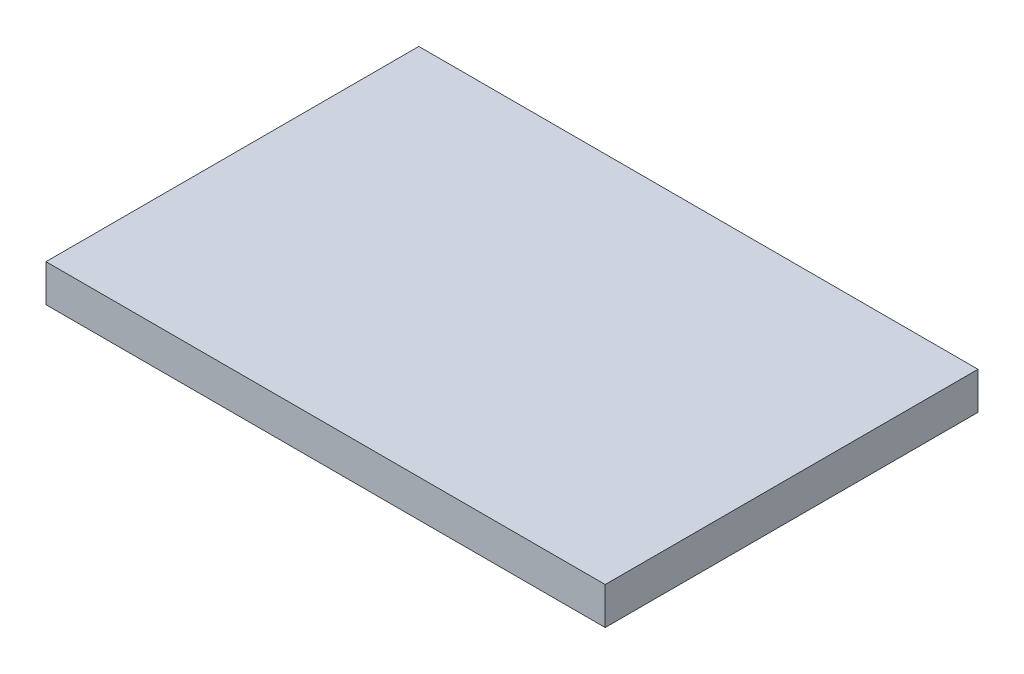
ISO-10303-21;
HEADER;
FILE_DESCRIPTION(('STEP AP214'),'2;1');
FILE_NAME('part.step','',(''),(''),'','','');
FILE_SCHEMA(('AUTOMOTIVE_DESIGN { 1 0 10303 214 1 1 1 1 }'));
ENDSEC;
DATA;
#1=APPLICATION_CONTEXT('core data for automotive mechanical design processes');
#2=APPLICATION_PROTOCOL_DEFINITION('international standard','automotive_design',2000,#1);
#3=PRODUCT_CONTEXT('',#1,'mechanical');
#4=PRODUCT('Part','Part','',(#3));
#5=PRODUCT_RELATED_PRODUCT_CATEGORY('part','',(#4));
#6=PRODUCT_DEFINITION_FORMATION('','',#4);
#7=PRODUCT_DEFINITION_CONTEXT('part definition',#1,'design');
#8=PRODUCT_DEFINITION('design','',#6,#7);
#9=PRODUCT_DEFINITION_SHAPE('','',#8);
#10=(LENGTH_UNIT() NAMED_UNIT(*) SI_UNIT(.MILLI.,.METRE.));
#11=(NAMED_UNIT(*) PLANE_ANGLE_UNIT() SI_UNIT($,.RADIAN.));
#12=(NAMED_UNIT(*) SI_UNIT($,.STERADIAN.) SOLID_ANGLE_UNIT());
#13=UNCERTAINTY_MEASURE_WITH_UNIT(LENGTH_MEASURE(1.E-05),#10,'distance_accuracy_value','');
#14=(GEOMETRIC_REPRESENTATION_CONTEXT(3) GLOBAL_UNCERTAINTY_ASSIGNED_CONTEXT((#13)) GLOBAL_UNIT_ASSIGNED_CONTEXT((#10,
#11,#12)) REPRESENTATION_CONTEXT('',''));
#15=CARTESIAN_POINT('',(0.,0.,0.));
#16=DIRECTION('',(0.,0.,1.));
#17=DIRECTION('',(1.,0.,0.));
#18=AXIS2_PLACEMENT_3D('',#15,#16,#17);
#19=CARTESIAN_POINT('',(0.,5.,0.));
#20=DIRECTION('',(-1.,0.,0.));
#21=DIRECTION('',(0.,0.,1.));
#22=AXIS2_PLACEMENT_3D('',#19,#20,#21);
#23=PLANE('',#22);
#24=DIRECTION('',(0.,0.,-1.));
#25=VECTOR('',#24,1.);
#26=CARTESIAN_POINT('',(0.,0.,0.));
#27=LINE('',#26,#25);
#28=CARTESIAN_POINT('',(0.,0.,0.));
#29=VERTEX_POINT('',#28);
#30=CARTESIAN_POINT('',(0.,0.,-50.));
#31=VERTEX_POINT('',#30);
#32=EDGE_CURVE('E98',#29,#31,#27,.T.);
#33=ORIENTED_EDGE('',*,*,#32,.F.);
#34=DIRECTION('',(0.,-1.,0.));
#35=VECTOR('',#34,1.);
#36=CARTESIAN_POINT('',(0.,5.,0.));
#37=LINE('',#36,#35);
#38=CARTESIAN_POINT('',(0.,5.,0.));
#39=VERTEX_POINT('',#38);
#40=EDGE_CURVE('E11',#39,#29,#37,.T.);
#41=ORIENTED_EDGE('',*,*,#40,.F.);
#42=DIRECTION('',(0.,0.,-1.));
#43=VECTOR('',#42,1.);
#44=CARTESIAN_POINT('',(0.,5.,0.));
#45=LINE('',#44,#43);
#46=CARTESIAN_POINT('',(0.,5.,-50.));
#47=VERTEX_POINT('',#46);
#48=EDGE_CURVE('E93',#39,#47,#45,.T.);
#49=ORIENTED_EDGE('',*,*,#48,.T.);
#50=DIRECTION('',(0.,-1.,0.));
#51=VECTOR('',#50,1.);
#52=CARTESIAN_POINT('',(0.,5.,-50.));
#53=LINE('',#52,#51);
#54=EDGE_CURVE('E36',#47,#31,#53,.T.);
#55=ORIENTED_EDGE('',*,*,#54,.T.);
#56=EDGE_LOOP('',(#33,#41,#49,#55));
#57=FACE_BOUND('',#56,.T.);
#58=ADVANCED_FACE('F33',(#57),#23,.T.);
#59=CARTESIAN_POINT('',(0.,5.,0.));
#60=DIRECTION('',(0.,0.,-1.));
#61=DIRECTION('',(-1.,0.,0.));
#62=AXIS2_PLACEMENT_3D('',#59,#60,#61);
#63=PLANE('',#62);
#64=DIRECTION('',(1.,0.,0.));
#65=VECTOR('',#64,1.);
#66=CARTESIAN_POINT('',(0.,0.,0.));
#67=LINE('',#66,#65);
#68=CARTESIAN_POINT('',(75.,0.,0.));
#69=VERTEX_POINT('',#68);
#70=EDGE_CURVE('E66',#29,#69,#67,.T.);
#71=ORIENTED_EDGE('',*,*,#70,.T.);
#72=DIRECTION('',(0.,-1.,0.));
#73=VECTOR('',#72,1.);
#74=CARTESIAN_POINT('',(75.,5.,0.));
#75=LINE('',#74,#73);
#76=CARTESIAN_POINT('',(75.,5.,0.));
#77=VERTEX_POINT('',#76);
#78=EDGE_CURVE('E42',#77,#69,#75,.T.);
#79=ORIENTED_EDGE('',*,*,#78,.F.);
#80=DIRECTION('',(1.,0.,0.));
#81=VECTOR('',#80,1.);
#82=CARTESIAN_POINT('',(0.,5.,0.));
#83=LINE('',#82,#81);
#84=EDGE_CURVE('E83',#39,#77,#83,.T.);
#85=ORIENTED_EDGE('',*,*,#84,.F.);
#86=ORIENTED_EDGE('',*,*,#40,.T.);
#87=EDGE_LOOP('',(#71,#79,#85,#86));
#88=FACE_BOUND('',#87,.T.);
#89=ADVANCED_FACE('F108',(#88),#63,.F.);
#90=CARTESIAN_POINT('',(75.,5.,0.));
#91=DIRECTION('',(-1.,0.,0.));
#92=DIRECTION('',(0.,0.,1.));
#93=AXIS2_PLACEMENT_3D('',#90,#91,#92);
#94=PLANE('',#93);
#95=DIRECTION('',(0.,0.,-1.));
#96=VECTOR('',#95,1.);
#97=CARTESIAN_POINT('',(75.,0.,0.));
#98=LINE('',#97,#96);
#99=CARTESIAN_POINT('',(75.,0.,-50.));
#100=VERTEX_POINT('',#99);
#101=EDGE_CURVE('E90',#69,#100,#98,.T.);
#102=ORIENTED_EDGE('',*,*,#101,.T.);
#103=DIRECTION('',(0.,-1.,0.));
#104=VECTOR('',#103,1.);
#105=CARTESIAN_POINT('',(75.,5.,-50.));
#106=LINE('',#105,#104);
#107=CARTESIAN_POINT('',(75.,5.,-50.));
#108=VERTEX_POINT('',#107);
#109=EDGE_CURVE('E87',#108,#100,#106,.T.);
#110=ORIENTED_EDGE('',*,*,#109,.F.);
#111=DIRECTION('',(0.,0.,-1.));
#112=VECTOR('',#111,1.);
#113=CARTESIAN_POINT('',(75.,5.,0.));
#114=LINE('',#113,#112);
#115=EDGE_CURVE('E78',#77,#108,#114,.T.);
#116=ORIENTED_EDGE('',*,*,#115,.F.);
#117=ORIENTED_EDGE('',*,*,#78,.T.);
#118=EDGE_LOOP('',(#102,#110,#116,#117));
#119=FACE_BOUND('',#118,.T.);
#120=ADVANCED_FACE('F88',(#119),#94,.F.);
#121=CARTESIAN_POINT('',(0.,5.,-50.));
#122=DIRECTION('',(0.,0.,-1.));
#123=DIRECTION('',(-1.,0.,0.));
#124=AXIS2_PLACEMENT_3D('',#121,#122,#123);
#125=PLANE('',#124);
#126=DIRECTION('',(1.,0.,0.));
#127=VECTOR('',#126,1.);
#128=CARTESIAN_POINT('',(0.,0.,-50.));
#129=LINE('',#128,#127);
#130=EDGE_CURVE('E101',#31,#100,#129,.T.);
#131=ORIENTED_EDGE('',*,*,#130,.F.);
#132=ORIENTED_EDGE('',*,*,#54,.F.);
#133=DIRECTION('',(1.,0.,0.));
#134=VECTOR('',#133,1.);
#135=CARTESIAN_POINT('',(0.,5.,-50.));
#136=LINE('',#135,#134);
#137=EDGE_CURVE('E82',#47,#108,#136,.T.);
#138=ORIENTED_EDGE('',*,*,#137,.T.);
#139=ORIENTED_EDGE('',*,*,#109,.T.);
#140=EDGE_LOOP('',(#131,#132,#138,#139));
#141=FACE_BOUND('',#140,.T.);
#142=ADVANCED_FACE('F92',(#141),#125,.T.);
#143=CARTESIAN_POINT('',(0.,5.,0.));
#144=DIRECTION('',(0.,-1.,0.));
#145=DIRECTION('',(0.,0.,-1.));
#146=AXIS2_PLACEMENT_3D('',#143,#144,#145);
#147=PLANE('',#146);
#148=ORIENTED_EDGE('',*,*,#48,.F.);
#149=ORIENTED_EDGE('',*,*,#84,.T.);
#150=ORIENTED_EDGE('',*,*,#115,.T.);
#151=ORIENTED_EDGE('',*,*,#137,.F.);
#152=EDGE_LOOP('',(#148,#149,#150,#151));
#153=FACE_BOUND('',#152,.T.);
#154=ADVANCED_FACE('F81',(#153),#147,.F.);
#155=CARTESIAN_POINT('',(0.,0.,0.));
#156=DIRECTION('',(0.,-1.,0.));
#157=DIRECTION('',(0.,0.,-1.));
#158=AXIS2_PLACEMENT_3D('',#155,#156,#157);
#159=PLANE('',#158);
#160=ORIENTED_EDGE('',*,*,#32,.T.);
#161=ORIENTED_EDGE('',*,*,#130,.T.);
#162=ORIENTED_EDGE('',*,*,#101,.F.);
#163=ORIENTED_EDGE('',*,*,#70,.F.);
#164=EDGE_LOOP('',(#160,#161,#162,#163));
#165=FACE_BOUND('',#164,.T.);
#166=ADVANCED_FACE('F106',(#165),#159,.T.);
#167=CLOSED_SHELL('',(#58,#89,#120,#142,#154,#166));
#168=MANIFOLD_SOLID_BREP('B2',#167);
#169=ADVANCED_BREP_SHAPE_REPRESENTATION('',(#18,#168),#14);
#170=SHAPE_DEFINITION_REPRESENTATION(#9,#169);
ENDSEC;
END-ISO-10303-21;
